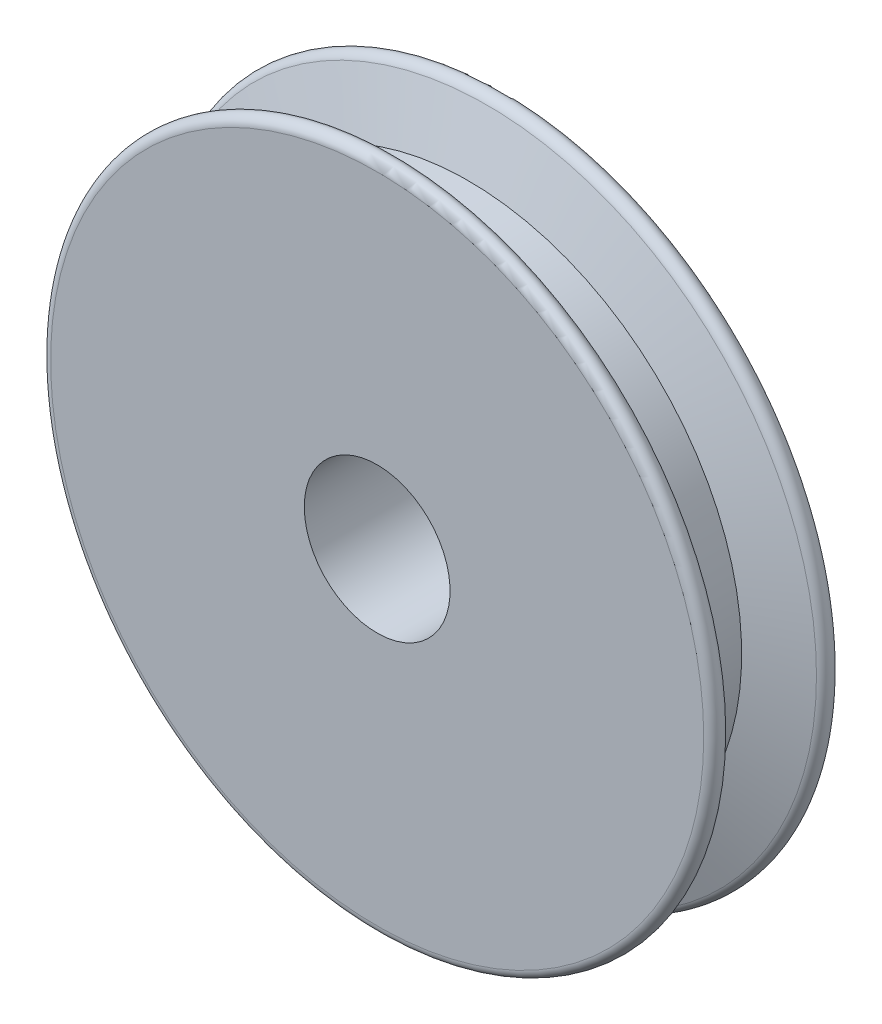
ISO-10303-21;
HEADER;
FILE_DESCRIPTION(('STEP AP214'),'2;1');
FILE_NAME('part.step','',(''),(''),'','','');
FILE_SCHEMA(('AUTOMOTIVE_DESIGN { 1 0 10303 214 1 1 1 1 }'));
ENDSEC;
DATA;
#1=APPLICATION_CONTEXT('core data for automotive mechanical design processes');
#2=APPLICATION_PROTOCOL_DEFINITION('international standard','automotive_design',2000,#1);
#3=PRODUCT_CONTEXT('',#1,'mechanical');
#4=PRODUCT('Part','Part','',(#3));
#5=PRODUCT_RELATED_PRODUCT_CATEGORY('part','',(#4));
#6=PRODUCT_DEFINITION_FORMATION('','',#4);
#7=PRODUCT_DEFINITION_CONTEXT('part definition',#1,'design');
#8=PRODUCT_DEFINITION('design','',#6,#7);
#9=PRODUCT_DEFINITION_SHAPE('','',#8);
#10=(LENGTH_UNIT() NAMED_UNIT(*) SI_UNIT(.MILLI.,.METRE.));
#11=(NAMED_UNIT(*) PLANE_ANGLE_UNIT() SI_UNIT($,.RADIAN.));
#12=(NAMED_UNIT(*) SI_UNIT($,.STERADIAN.) SOLID_ANGLE_UNIT());
#13=UNCERTAINTY_MEASURE_WITH_UNIT(LENGTH_MEASURE(1.E-05),#10,'distance_accuracy_value','');
#14=(GEOMETRIC_REPRESENTATION_CONTEXT(3) GLOBAL_UNCERTAINTY_ASSIGNED_CONTEXT((#13)) GLOBAL_UNIT_ASSIGNED_CONTEXT((#10,
#11,#12)) REPRESENTATION_CONTEXT('',''));
#15=CARTESIAN_POINT('',(0.,0.,0.));
#16=DIRECTION('',(0.,0.,1.));
#17=DIRECTION('',(1.,0.,0.));
#18=AXIS2_PLACEMENT_3D('',#15,#16,#17);
#19=CARTESIAN_POINT('',(0.,10.16,0.));
#20=DIRECTION('',(0.,0.,-1.));
#21=DIRECTION('',(-1.,0.,0.));
#22=AXIS2_PLACEMENT_3D('',#19,#20,#21);
#23=PLANE('',#22);
#24=CARTESIAN_POINT('',(0.,0.,0.));
#25=DIRECTION('',(0.,0.,-1.));
#26=DIRECTION('',(-1.,0.,0.));
#27=AXIS2_PLACEMENT_3D('',#24,#25,#26);
#28=CIRCLE('',#27,45.5226363889166);
#29=CARTESIAN_POINT('',(-45.5226363889166,0.,0.));
#30=VERTEX_POINT('',#29);
#31=EDGE_CURVE('E64',#30,#30,#28,.T.);
#32=ORIENTED_EDGE('',*,*,#31,.T.);
#33=EDGE_LOOP('',(#32));
#34=FACE_BOUND('',#33,.T.);
#35=CARTESIAN_POINT('',(0.,0.,0.));
#36=DIRECTION('',(0.,0.,-1.));
#37=DIRECTION('',(-1.,0.,0.));
#38=AXIS2_PLACEMENT_3D('',#35,#36,#37);
#39=CIRCLE('',#38,10.16);
#40=CARTESIAN_POINT('',(-10.16,0.,0.));
#41=VERTEX_POINT('',#40);
#42=EDGE_CURVE('E78',#41,#41,#39,.T.);
#43=ORIENTED_EDGE('',*,*,#42,.F.);
#44=EDGE_LOOP('',(#43));
#45=FACE_BOUND('',#44,.T.);
#46=ADVANCED_FACE('F43',(#34,#45),#23,.T.);
#47=CARTESIAN_POINT('',(0.,0.,0.));
#48=DIRECTION('',(0.,0.,-1.));
#49=DIRECTION('',(-1.,0.,0.));
#50=AXIS2_PLACEMENT_3D('',#47,#48,#49);
#51=CONICAL_SURFACE('',#50,53.3570217354495,1.24938050943365);
#52=CARTESIAN_POINT('',(0.,0.,2.47496215451586));
#53=DIRECTION('',(0.,0.,1.));
#54=DIRECTION('',(1.,0.,0.));
#55=AXIS2_PLACEMENT_3D('',#52,#53,#54);
#56=CIRCLE('',#55,45.9238423287834);
#57=CARTESIAN_POINT('',(45.9238423287834,0.,2.47496215451586));
#58=VERTEX_POINT('',#57);
#59=EDGE_CURVE('E57',#58,#58,#56,.T.);
#60=ORIENTED_EDGE('',*,*,#59,.T.);
#61=EDGE_LOOP('',(#60));
#62=FACE_BOUND('',#61,.T.);
#63=CARTESIAN_POINT('',(0.,0.,5.08));
#64=DIRECTION('',(0.,0.,-1.));
#65=DIRECTION('',(-1.,0.,0.));
#66=AXIS2_PLACEMENT_3D('',#63,#64,#65);
#67=CIRCLE('',#66,38.1);
#68=CARTESIAN_POINT('',(-38.1,0.,5.08));
#69=VERTEX_POINT('',#68);
#70=EDGE_CURVE('E70',#69,#69,#67,.T.);
#71=ORIENTED_EDGE('',*,*,#70,.T.);
#72=EDGE_LOOP('',(#71));
#73=FACE_BOUND('',#72,.T.);
#74=ADVANCED_FACE('F86',(#62,#73),#51,.T.);
#75=CARTESIAN_POINT('',(0.,0.,0.));
#76=DIRECTION('',(0.,0.,-1.));
#77=DIRECTION('',(-1.,0.,0.));
#78=AXIS2_PLACEMENT_3D('',#75,#76,#77);
#79=CYLINDRICAL_SURFACE('',#78,38.1);
#80=CARTESIAN_POINT('',(0.,0.,12.7));
#81=DIRECTION('',(0.,0.,-1.));
#82=DIRECTION('',(-1.,0.,0.));
#83=AXIS2_PLACEMENT_3D('',#80,#81,#82);
#84=CIRCLE('',#83,38.1);
#85=CARTESIAN_POINT('',(-38.1,0.,12.7));
#86=VERTEX_POINT('',#85);
#87=EDGE_CURVE('E72',#86,#86,#84,.T.);
#88=ORIENTED_EDGE('',*,*,#87,.T.);
#89=EDGE_LOOP('',(#88));
#90=FACE_BOUND('',#89,.T.);
#91=ORIENTED_EDGE('',*,*,#70,.F.);
#92=EDGE_LOOP('',(#91));
#93=FACE_BOUND('',#92,.T.);
#94=ADVANCED_FACE('F92',(#90,#93),#79,.T.);
#95=CARTESIAN_POINT('',(0.,0.,12.7));
#96=DIRECTION('',(0.,0.,1.));
#97=DIRECTION('',(1.,0.,0.));
#98=AXIS2_PLACEMENT_3D('',#95,#96,#97);
#99=CONICAL_SURFACE('',#98,38.1,1.24904577239825);
#100=CARTESIAN_POINT('',(0.,0.,15.3051722114758));
#101=DIRECTION('',(0.,0.,-1.));
#102=DIRECTION('',(-1.,0.,0.));
#103=AXIS2_PLACEMENT_3D('',#100,#101,#102);
#104=CIRCLE('',#103,45.9155166344275);
#105=CARTESIAN_POINT('',(-45.9155166344275,0.,15.3051722114758));
#106=VERTEX_POINT('',#105);
#107=EDGE_CURVE('E51',#106,#106,#104,.T.);
#108=ORIENTED_EDGE('',*,*,#107,.T.);
#109=EDGE_LOOP('',(#108));
#110=FACE_BOUND('',#109,.T.);
#111=ORIENTED_EDGE('',*,*,#87,.F.);
#112=EDGE_LOOP('',(#111));
#113=FACE_BOUND('',#112,.T.);
#114=ADVANCED_FACE('F119',(#110,#113),#99,.T.);
#115=CARTESIAN_POINT('',(0.,10.16,17.78));
#116=DIRECTION('',(0.,0.,1.));
#117=DIRECTION('',(1.,0.,0.));
#118=AXIS2_PLACEMENT_3D('',#115,#116,#117);
#119=PLANE('',#118);
#120=CARTESIAN_POINT('',(0.,0.,17.78));
#121=DIRECTION('',(0.,0.,1.));
#122=DIRECTION('',(1.,0.,0.));
#123=AXIS2_PLACEMENT_3D('',#120,#121,#122);
#124=CIRCLE('',#123,45.5139073715861);
#125=CARTESIAN_POINT('',(45.5139073715861,0.,17.78));
#126=VERTEX_POINT('',#125);
#127=EDGE_CURVE('E10',#126,#126,#124,.T.);
#128=ORIENTED_EDGE('',*,*,#127,.T.);
#129=EDGE_LOOP('',(#128));
#130=FACE_BOUND('',#129,.T.);
#131=CARTESIAN_POINT('',(0.,0.,17.78));
#132=DIRECTION('',(0.,0.,-1.));
#133=DIRECTION('',(-1.,0.,0.));
#134=AXIS2_PLACEMENT_3D('',#131,#132,#133);
#135=CIRCLE('',#134,10.16);
#136=CARTESIAN_POINT('',(-10.16,0.,17.78));
#137=VERTEX_POINT('',#136);
#138=EDGE_CURVE('E73',#137,#137,#135,.T.);
#139=ORIENTED_EDGE('',*,*,#138,.T.);
#140=EDGE_LOOP('',(#139));
#141=FACE_BOUND('',#140,.T.);
#142=ADVANCED_FACE('F110',(#130,#141),#119,.T.);
#143=CARTESIAN_POINT('',(0.,0.,0.));
#144=DIRECTION('',(0.,0.,-1.));
#145=DIRECTION('',(-1.,0.,0.));
#146=AXIS2_PLACEMENT_3D('',#143,#144,#145);
#147=CYLINDRICAL_SURFACE('',#146,10.16);
#148=ORIENTED_EDGE('',*,*,#42,.T.);
#149=EDGE_LOOP('',(#148));
#150=FACE_BOUND('',#149,.T.);
#151=ORIENTED_EDGE('',*,*,#138,.F.);
#152=EDGE_LOOP('',(#151));
#153=FACE_BOUND('',#152,.T.);
#154=ADVANCED_FACE('F81',(#150,#153),#147,.F.);
#155=CARTESIAN_POINT('',(0.,0.,1.27));
#156=DIRECTION('',(0.,0.,-1.));
#157=DIRECTION('',(-1.,0.,0.));
#158=AXIS2_PLACEMENT_3D('',#155,#156,#157);
#159=TOROIDAL_SURFACE('',#158,45.5226363889166,1.27);
#160=ORIENTED_EDGE('',*,*,#59,.F.);
#161=EDGE_LOOP('',(#160));
#162=FACE_BOUND('',#161,.T.);
#163=ORIENTED_EDGE('',*,*,#31,.F.);
#164=EDGE_LOOP('',(#163));
#165=FACE_BOUND('',#164,.T.);
#166=ADVANCED_FACE('F97',(#162,#165),#159,.T.);
#167=CARTESIAN_POINT('',(0.,0.,16.51));
#168=DIRECTION('',(0.,0.,1.));
#169=DIRECTION('',(1.,0.,0.));
#170=AXIS2_PLACEMENT_3D('',#167,#168,#169);
#171=TOROIDAL_SURFACE('',#170,45.5139073715861,1.27);
#172=ORIENTED_EDGE('',*,*,#127,.F.);
#173=EDGE_LOOP('',(#172));
#174=FACE_BOUND('',#173,.T.);
#175=ORIENTED_EDGE('',*,*,#107,.F.);
#176=EDGE_LOOP('',(#175));
#177=FACE_BOUND('',#176,.T.);
#178=ADVANCED_FACE('F44',(#174,#177),#171,.T.);
#179=CLOSED_SHELL('',(#46,#74,#94,#114,#142,#154,#166,#178));
#180=MANIFOLD_SOLID_BREP('B2',#179);
#181=ADVANCED_BREP_SHAPE_REPRESENTATION('',(#18,#180),#14);
#182=SHAPE_DEFINITION_REPRESENTATION(#9,#181);
ENDSEC;
END-ISO-10303-21;
